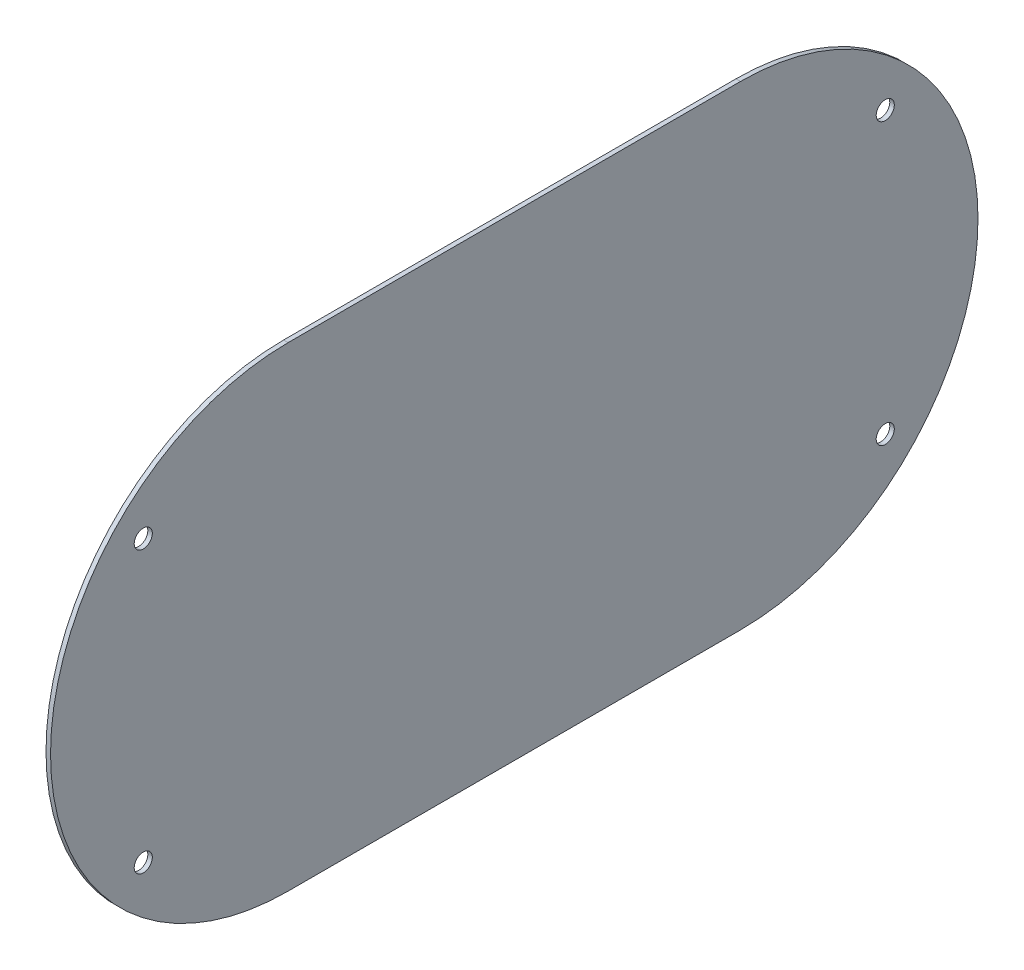
ISO-10303-21;
HEADER;
FILE_DESCRIPTION(('STEP AP214'),'2;1');
FILE_NAME('part.step','',(''),(''),'','','');
FILE_SCHEMA(('AUTOMOTIVE_DESIGN { 1 0 10303 214 1 1 1 1 }'));
ENDSEC;
DATA;
#1=APPLICATION_CONTEXT('core data for automotive mechanical design processes');
#2=APPLICATION_PROTOCOL_DEFINITION('international standard','automotive_design',2000,#1);
#3=PRODUCT_CONTEXT('',#1,'mechanical');
#4=PRODUCT('Part','Part','',(#3));
#5=PRODUCT_RELATED_PRODUCT_CATEGORY('part','',(#4));
#6=PRODUCT_DEFINITION_FORMATION('','',#4);
#7=PRODUCT_DEFINITION_CONTEXT('part definition',#1,'design');
#8=PRODUCT_DEFINITION('design','',#6,#7);
#9=PRODUCT_DEFINITION_SHAPE('','',#8);
#10=(LENGTH_UNIT() NAMED_UNIT(*) SI_UNIT(.MILLI.,.METRE.));
#11=(NAMED_UNIT(*) PLANE_ANGLE_UNIT() SI_UNIT($,.RADIAN.));
#12=(NAMED_UNIT(*) SI_UNIT($,.STERADIAN.) SOLID_ANGLE_UNIT());
#13=UNCERTAINTY_MEASURE_WITH_UNIT(LENGTH_MEASURE(1.E-05),#10,'distance_accuracy_value','');
#14=(GEOMETRIC_REPRESENTATION_CONTEXT(3) GLOBAL_UNCERTAINTY_ASSIGNED_CONTEXT((#13)) GLOBAL_UNIT_ASSIGNED_CONTEXT((#10,
#11,#12)) REPRESENTATION_CONTEXT('',''));
#15=CARTESIAN_POINT('',(0.,0.,0.));
#16=DIRECTION('',(0.,0.,1.));
#17=DIRECTION('',(1.,0.,0.));
#18=AXIS2_PLACEMENT_3D('',#15,#16,#17);
#19=CARTESIAN_POINT('',(0.,0.,0.));
#20=DIRECTION('',(1.,0.,0.));
#21=DIRECTION('',(0.,1.,0.));
#22=AXIS2_PLACEMENT_3D('',#19,#20,#21);
#23=PLANE('',#22);
#24=CARTESIAN_POINT('',(0.,31.,82.));
#25=DIRECTION('',(-1.,0.,0.));
#26=DIRECTION('',(0.,-1.,0.));
#27=AXIS2_PLACEMENT_3D('',#24,#25,#26);
#28=CIRCLE('',#27,2.);
#29=CARTESIAN_POINT('',(0.,33.,82.));
#30=VERTEX_POINT('',#29);
#31=EDGE_CURVE('E172',#30,#30,#28,.T.);
#32=ORIENTED_EDGE('',*,*,#31,.F.);
#33=EDGE_LOOP('',(#32));
#34=FACE_BOUND('',#33,.T.);
#35=CARTESIAN_POINT('',(0.,31.,-82.));
#36=DIRECTION('',(-1.,0.,0.));
#37=DIRECTION('',(0.,-1.,0.));
#38=AXIS2_PLACEMENT_3D('',#35,#36,#37);
#39=CIRCLE('',#38,2.);
#40=CARTESIAN_POINT('',(0.,33.,-82.));
#41=VERTEX_POINT('',#40);
#42=EDGE_CURVE('E179',#41,#41,#39,.T.);
#43=ORIENTED_EDGE('',*,*,#42,.F.);
#44=EDGE_LOOP('',(#43));
#45=FACE_BOUND('',#44,.T.);
#46=CARTESIAN_POINT('',(0.,-31.,-82.));
#47=DIRECTION('',(-1.,0.,0.));
#48=DIRECTION('',(0.,-1.,0.));
#49=AXIS2_PLACEMENT_3D('',#46,#47,#48);
#50=CIRCLE('',#49,2.);
#51=CARTESIAN_POINT('',(0.,-29.,-82.));
#52=VERTEX_POINT('',#51);
#53=EDGE_CURVE('E127',#52,#52,#50,.T.);
#54=ORIENTED_EDGE('',*,*,#53,.F.);
#55=EDGE_LOOP('',(#54));
#56=FACE_BOUND('',#55,.T.);
#57=CARTESIAN_POINT('',(0.,-31.,82.));
#58=DIRECTION('',(-1.,0.,0.));
#59=DIRECTION('',(0.,-1.,0.));
#60=AXIS2_PLACEMENT_3D('',#57,#58,#59);
#61=CIRCLE('',#60,2.);
#62=CARTESIAN_POINT('',(0.,-29.,82.));
#63=VERTEX_POINT('',#62);
#64=EDGE_CURVE('E151',#63,#63,#61,.T.);
#65=ORIENTED_EDGE('',*,*,#64,.F.);
#66=EDGE_LOOP('',(#65));
#67=FACE_BOUND('',#66,.T.);
#68=CARTESIAN_POINT('',(0.,0.,-50.));
#69=DIRECTION('',(1.,0.,0.));
#70=DIRECTION('',(0.,-1.,0.));
#71=AXIS2_PLACEMENT_3D('',#68,#69,#70);
#72=CIRCLE('',#71,52.5);
#73=CARTESIAN_POINT('',(0.,-52.5,-50.));
#74=VERTEX_POINT('',#73);
#75=CARTESIAN_POINT('',(0.,52.5,-50.));
#76=VERTEX_POINT('',#75);
#77=EDGE_CURVE('E26',#74,#76,#72,.T.);
#78=ORIENTED_EDGE('',*,*,#77,.F.);
#79=DIRECTION('',(0.,0.,-1.));
#80=VECTOR('',#79,1.);
#81=CARTESIAN_POINT('',(0.,-52.5,50.));
#82=LINE('',#81,#80);
#83=CARTESIAN_POINT('',(0.,-52.5,50.));
#84=VERTEX_POINT('',#83);
#85=EDGE_CURVE('E133',#84,#74,#82,.T.);
#86=ORIENTED_EDGE('',*,*,#85,.F.);
#87=CARTESIAN_POINT('',(0.,0.,50.));
#88=DIRECTION('',(1.,0.,0.));
#89=DIRECTION('',(0.,1.,0.));
#90=AXIS2_PLACEMENT_3D('',#87,#88,#89);
#91=CIRCLE('',#90,52.5);
#92=CARTESIAN_POINT('',(0.,52.5,50.));
#93=VERTEX_POINT('',#92);
#94=EDGE_CURVE('E118',#93,#84,#91,.T.);
#95=ORIENTED_EDGE('',*,*,#94,.F.);
#96=DIRECTION('',(0.,0.,1.));
#97=VECTOR('',#96,1.);
#98=CARTESIAN_POINT('',(0.,52.5,-50.));
#99=LINE('',#98,#97);
#100=EDGE_CURVE('E103',#76,#93,#99,.T.);
#101=ORIENTED_EDGE('',*,*,#100,.F.);
#102=EDGE_LOOP('',(#78,#86,#95,#101));
#103=FACE_BOUND('',#102,.T.);
#104=ADVANCED_FACE('F16',(#34,#45,#56,#67,#103),#23,.F.);
#105=CARTESIAN_POINT('',(1.,0.,0.));
#106=DIRECTION('',(1.,0.,0.));
#107=DIRECTION('',(0.,1.,0.));
#108=AXIS2_PLACEMENT_3D('',#105,#106,#107);
#109=PLANE('',#108);
#110=CARTESIAN_POINT('',(1.,31.,82.));
#111=DIRECTION('',(-1.,0.,0.));
#112=DIRECTION('',(0.,-1.,0.));
#113=AXIS2_PLACEMENT_3D('',#110,#111,#112);
#114=CIRCLE('',#113,2.);
#115=CARTESIAN_POINT('',(1.,33.,82.));
#116=VERTEX_POINT('',#115);
#117=EDGE_CURVE('E138',#116,#116,#114,.T.);
#118=ORIENTED_EDGE('',*,*,#117,.T.);
#119=EDGE_LOOP('',(#118));
#120=FACE_BOUND('',#119,.T.);
#121=CARTESIAN_POINT('',(1.,31.,-82.));
#122=DIRECTION('',(-1.,0.,0.));
#123=DIRECTION('',(0.,-1.,0.));
#124=AXIS2_PLACEMENT_3D('',#121,#122,#123);
#125=CIRCLE('',#124,2.);
#126=CARTESIAN_POINT('',(1.,33.,-82.));
#127=VERTEX_POINT('',#126);
#128=EDGE_CURVE('E189',#127,#127,#125,.T.);
#129=ORIENTED_EDGE('',*,*,#128,.T.);
#130=EDGE_LOOP('',(#129));
#131=FACE_BOUND('',#130,.T.);
#132=CARTESIAN_POINT('',(1.,-31.,-82.));
#133=DIRECTION('',(-1.,0.,0.));
#134=DIRECTION('',(0.,-1.,0.));
#135=AXIS2_PLACEMENT_3D('',#132,#133,#134);
#136=CIRCLE('',#135,2.);
#137=CARTESIAN_POINT('',(1.,-29.,-82.));
#138=VERTEX_POINT('',#137);
#139=EDGE_CURVE('E156',#138,#138,#136,.T.);
#140=ORIENTED_EDGE('',*,*,#139,.T.);
#141=EDGE_LOOP('',(#140));
#142=FACE_BOUND('',#141,.T.);
#143=CARTESIAN_POINT('',(1.,-31.,82.));
#144=DIRECTION('',(-1.,0.,0.));
#145=DIRECTION('',(0.,-1.,0.));
#146=AXIS2_PLACEMENT_3D('',#143,#144,#145);
#147=CIRCLE('',#146,2.);
#148=CARTESIAN_POINT('',(1.,-29.,82.));
#149=VERTEX_POINT('',#148);
#150=EDGE_CURVE('E143',#149,#149,#147,.T.);
#151=ORIENTED_EDGE('',*,*,#150,.T.);
#152=EDGE_LOOP('',(#151));
#153=FACE_BOUND('',#152,.T.);
#154=CARTESIAN_POINT('',(1.,0.,-50.));
#155=DIRECTION('',(1.,0.,0.));
#156=DIRECTION('',(0.,-1.,0.));
#157=AXIS2_PLACEMENT_3D('',#154,#155,#156);
#158=CIRCLE('',#157,52.5);
#159=CARTESIAN_POINT('',(1.,-52.5,-50.));
#160=VERTEX_POINT('',#159);
#161=CARTESIAN_POINT('',(1.,52.5,-50.));
#162=VERTEX_POINT('',#161);
#163=EDGE_CURVE('E11',#160,#162,#158,.T.);
#164=ORIENTED_EDGE('',*,*,#163,.T.);
#165=DIRECTION('',(0.,0.,1.));
#166=VECTOR('',#165,1.);
#167=CARTESIAN_POINT('',(1.,52.5,-50.));
#168=LINE('',#167,#166);
#169=CARTESIAN_POINT('',(1.,52.5,50.));
#170=VERTEX_POINT('',#169);
#171=EDGE_CURVE('E93',#162,#170,#168,.T.);
#172=ORIENTED_EDGE('',*,*,#171,.T.);
#173=CARTESIAN_POINT('',(1.,0.,50.));
#174=DIRECTION('',(1.,0.,0.));
#175=DIRECTION('',(0.,1.,0.));
#176=AXIS2_PLACEMENT_3D('',#173,#174,#175);
#177=CIRCLE('',#176,52.5);
#178=CARTESIAN_POINT('',(1.,-52.5,50.));
#179=VERTEX_POINT('',#178);
#180=EDGE_CURVE('E97',#170,#179,#177,.T.);
#181=ORIENTED_EDGE('',*,*,#180,.T.);
#182=DIRECTION('',(0.,0.,-1.));
#183=VECTOR('',#182,1.);
#184=CARTESIAN_POINT('',(1.,-52.5,50.));
#185=LINE('',#184,#183);
#186=EDGE_CURVE('E132',#179,#160,#185,.T.);
#187=ORIENTED_EDGE('',*,*,#186,.T.);
#188=EDGE_LOOP('',(#164,#172,#181,#187));
#189=FACE_BOUND('',#188,.T.);
#190=ADVANCED_FACE('F95',(#120,#131,#142,#153,#189),#109,.T.);
#191=CARTESIAN_POINT('',(0.,0.,-50.));
#192=DIRECTION('',(1.,0.,0.));
#193=DIRECTION('',(0.,-1.,0.));
#194=AXIS2_PLACEMENT_3D('',#191,#192,#193);
#195=CYLINDRICAL_SURFACE('',#194,52.5);
#196=ORIENTED_EDGE('',*,*,#77,.T.);
#197=DIRECTION('',(1.,0.,0.));
#198=VECTOR('',#197,1.);
#199=CARTESIAN_POINT('',(0.,52.5,-50.));
#200=LINE('',#199,#198);
#201=EDGE_CURVE('E102',#76,#162,#200,.T.);
#202=ORIENTED_EDGE('',*,*,#201,.T.);
#203=ORIENTED_EDGE('',*,*,#163,.F.);
#204=DIRECTION('',(1.,0.,0.));
#205=VECTOR('',#204,1.);
#206=CARTESIAN_POINT('',(0.,-52.5,-50.));
#207=LINE('',#206,#205);
#208=EDGE_CURVE('E129',#74,#160,#207,.T.);
#209=ORIENTED_EDGE('',*,*,#208,.F.);
#210=EDGE_LOOP('',(#196,#202,#203,#209));
#211=FACE_BOUND('',#210,.T.);
#212=ADVANCED_FACE('F18',(#211),#195,.T.);
#213=CARTESIAN_POINT('',(0.,52.5,-50.));
#214=DIRECTION('',(0.,1.,0.));
#215=DIRECTION('',(0.,0.,-1.));
#216=AXIS2_PLACEMENT_3D('',#213,#214,#215);
#217=PLANE('',#216);
#218=ORIENTED_EDGE('',*,*,#100,.T.);
#219=DIRECTION('',(1.,0.,0.));
#220=VECTOR('',#219,1.);
#221=CARTESIAN_POINT('',(0.,52.5,50.));
#222=LINE('',#221,#220);
#223=EDGE_CURVE('E106',#93,#170,#222,.T.);
#224=ORIENTED_EDGE('',*,*,#223,.T.);
#225=ORIENTED_EDGE('',*,*,#171,.F.);
#226=ORIENTED_EDGE('',*,*,#201,.F.);
#227=EDGE_LOOP('',(#218,#224,#225,#226));
#228=FACE_BOUND('',#227,.T.);
#229=ADVANCED_FACE('F107',(#228),#217,.T.);
#230=CARTESIAN_POINT('',(0.,0.,50.));
#231=DIRECTION('',(1.,0.,0.));
#232=DIRECTION('',(0.,1.,0.));
#233=AXIS2_PLACEMENT_3D('',#230,#231,#232);
#234=CYLINDRICAL_SURFACE('',#233,52.5);
#235=ORIENTED_EDGE('',*,*,#94,.T.);
#236=DIRECTION('',(1.,0.,0.));
#237=VECTOR('',#236,1.);
#238=CARTESIAN_POINT('',(0.,-52.5,50.));
#239=LINE('',#238,#237);
#240=EDGE_CURVE('E115',#84,#179,#239,.T.);
#241=ORIENTED_EDGE('',*,*,#240,.T.);
#242=ORIENTED_EDGE('',*,*,#180,.F.);
#243=ORIENTED_EDGE('',*,*,#223,.F.);
#244=EDGE_LOOP('',(#235,#241,#242,#243));
#245=FACE_BOUND('',#244,.T.);
#246=ADVANCED_FACE('F113',(#245),#234,.T.);
#247=CARTESIAN_POINT('',(0.,-52.5,50.));
#248=DIRECTION('',(0.,-1.,0.));
#249=DIRECTION('',(0.,0.,-1.));
#250=AXIS2_PLACEMENT_3D('',#247,#248,#249);
#251=PLANE('',#250);
#252=ORIENTED_EDGE('',*,*,#85,.T.);
#253=ORIENTED_EDGE('',*,*,#208,.T.);
#254=ORIENTED_EDGE('',*,*,#186,.F.);
#255=ORIENTED_EDGE('',*,*,#240,.F.);
#256=EDGE_LOOP('',(#252,#253,#254,#255));
#257=FACE_BOUND('',#256,.T.);
#258=ADVANCED_FACE('F166',(#257),#251,.T.);
#259=CARTESIAN_POINT('',(0.,-31.,82.));
#260=DIRECTION('',(1.,0.,0.));
#261=DIRECTION('',(0.,-1.,0.));
#262=AXIS2_PLACEMENT_3D('',#259,#260,#261);
#263=CYLINDRICAL_SURFACE('',#262,2.);
#264=ORIENTED_EDGE('',*,*,#150,.F.);
#265=DIRECTION('',(-1.,0.,0.));
#266=VECTOR('',#265,1.);
#267=CARTESIAN_POINT('',(0.,-29.,82.));
#268=LINE('',#267,#266);
#269=EDGE_CURVE('E147',#149,#63,#268,.T.);
#270=ORIENTED_EDGE('',*,*,#269,.T.);
#271=ORIENTED_EDGE('',*,*,#64,.T.);
#272=ORIENTED_EDGE('',*,*,#269,.F.);
#273=EDGE_LOOP('',(#264,#270,#271,#272));
#274=FACE_BOUND('',#273,.T.);
#275=ADVANCED_FACE('F213',(#274),#263,.F.);
#276=CARTESIAN_POINT('',(0.,-31.,-82.));
#277=DIRECTION('',(1.,0.,0.));
#278=DIRECTION('',(0.,-1.,0.));
#279=AXIS2_PLACEMENT_3D('',#276,#277,#278);
#280=CYLINDRICAL_SURFACE('',#279,2.);
#281=ORIENTED_EDGE('',*,*,#139,.F.);
#282=DIRECTION('',(-1.,0.,0.));
#283=VECTOR('',#282,1.);
#284=CARTESIAN_POINT('',(0.,-29.,-82.));
#285=LINE('',#284,#283);
#286=EDGE_CURVE('E152',#138,#52,#285,.T.);
#287=ORIENTED_EDGE('',*,*,#286,.T.);
#288=ORIENTED_EDGE('',*,*,#53,.T.);
#289=ORIENTED_EDGE('',*,*,#286,.F.);
#290=EDGE_LOOP('',(#281,#287,#288,#289));
#291=FACE_BOUND('',#290,.T.);
#292=ADVANCED_FACE('F228',(#291),#280,.F.);
#293=CARTESIAN_POINT('',(0.,31.,-82.));
#294=DIRECTION('',(1.,0.,0.));
#295=DIRECTION('',(0.,-1.,0.));
#296=AXIS2_PLACEMENT_3D('',#293,#294,#295);
#297=CYLINDRICAL_SURFACE('',#296,2.);
#298=ORIENTED_EDGE('',*,*,#128,.F.);
#299=DIRECTION('',(-1.,0.,0.));
#300=VECTOR('',#299,1.);
#301=CARTESIAN_POINT('',(0.,33.,-82.));
#302=LINE('',#301,#300);
#303=EDGE_CURVE('E183',#127,#41,#302,.T.);
#304=ORIENTED_EDGE('',*,*,#303,.T.);
#305=ORIENTED_EDGE('',*,*,#42,.T.);
#306=ORIENTED_EDGE('',*,*,#303,.F.);
#307=EDGE_LOOP('',(#298,#304,#305,#306));
#308=FACE_BOUND('',#307,.T.);
#309=ADVANCED_FACE('F223',(#308),#297,.F.);
#310=CARTESIAN_POINT('',(0.,31.,82.));
#311=DIRECTION('',(1.,0.,0.));
#312=DIRECTION('',(0.,-1.,0.));
#313=AXIS2_PLACEMENT_3D('',#310,#311,#312);
#314=CYLINDRICAL_SURFACE('',#313,2.);
#315=ORIENTED_EDGE('',*,*,#117,.F.);
#316=DIRECTION('',(-1.,0.,0.));
#317=VECTOR('',#316,1.);
#318=CARTESIAN_POINT('',(0.,33.,82.));
#319=LINE('',#318,#317);
#320=EDGE_CURVE('E142',#116,#30,#319,.T.);
#321=ORIENTED_EDGE('',*,*,#320,.T.);
#322=ORIENTED_EDGE('',*,*,#31,.T.);
#323=ORIENTED_EDGE('',*,*,#320,.F.);
#324=EDGE_LOOP('',(#315,#321,#322,#323));
#325=FACE_BOUND('',#324,.T.);
#326=ADVANCED_FACE('F201',(#325),#314,.F.);
#327=CLOSED_SHELL('',(#104,#190,#212,#229,#246,#258,#275,#292,#309,#326));
#328=MANIFOLD_SOLID_BREP('B1',#327);
#329=ADVANCED_BREP_SHAPE_REPRESENTATION('',(#18,#328),#14);
#330=SHAPE_DEFINITION_REPRESENTATION(#9,#329);
ENDSEC;
END-ISO-10303-21;
